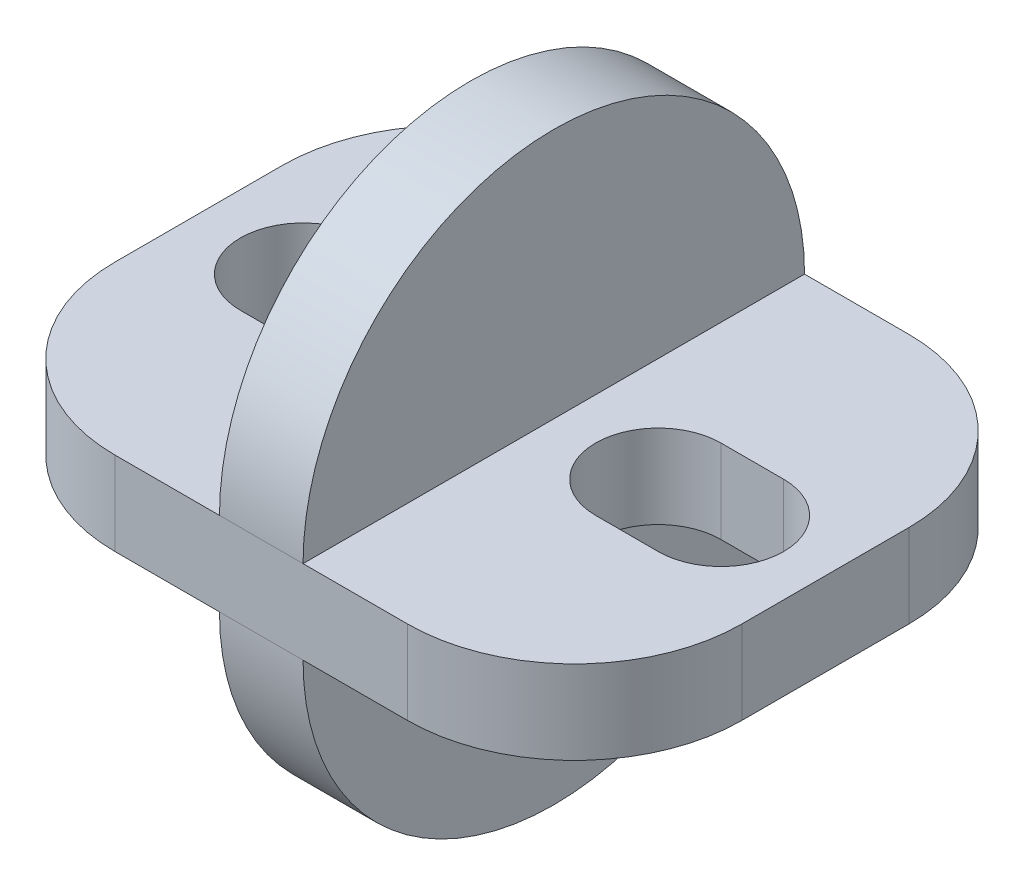
ISO-10303-21;
HEADER;
FILE_DESCRIPTION(('STEP AP214'),'2;1');
FILE_NAME('part.step','',(''),(''),'','','');
FILE_SCHEMA(('AUTOMOTIVE_DESIGN { 1 0 10303 214 1 1 1 1 }'));
ENDSEC;
DATA;
#1=APPLICATION_CONTEXT('core data for automotive mechanical design processes');
#2=APPLICATION_PROTOCOL_DEFINITION('international standard','automotive_design',2000,#1);
#3=PRODUCT_CONTEXT('',#1,'mechanical');
#4=PRODUCT('Part','Part','',(#3));
#5=PRODUCT_RELATED_PRODUCT_CATEGORY('part','',(#4));
#6=PRODUCT_DEFINITION_FORMATION('','',#4);
#7=PRODUCT_DEFINITION_CONTEXT('part definition',#1,'design');
#8=PRODUCT_DEFINITION('design','',#6,#7);
#9=PRODUCT_DEFINITION_SHAPE('','',#8);
#10=(LENGTH_UNIT() NAMED_UNIT(*) SI_UNIT(.MILLI.,.METRE.));
#11=(NAMED_UNIT(*) PLANE_ANGLE_UNIT() SI_UNIT($,.RADIAN.));
#12=(NAMED_UNIT(*) SI_UNIT($,.STERADIAN.) SOLID_ANGLE_UNIT());
#13=UNCERTAINTY_MEASURE_WITH_UNIT(LENGTH_MEASURE(1.E-05),#10,'distance_accuracy_value','');
#14=(GEOMETRIC_REPRESENTATION_CONTEXT(3) GLOBAL_UNCERTAINTY_ASSIGNED_CONTEXT((#13)) GLOBAL_UNIT_ASSIGNED_CONTEXT((#10,
#11,#12)) REPRESENTATION_CONTEXT('',''));
#15=CARTESIAN_POINT('',(0.,0.,0.));
#16=DIRECTION('',(0.,0.,1.));
#17=DIRECTION('',(1.,0.,0.));
#18=AXIS2_PLACEMENT_3D('',#15,#16,#17);
#19=CARTESIAN_POINT('',(0.,0.,0.));
#20=DIRECTION('',(0.,1.,0.));
#21=DIRECTION('',(0.,0.,1.));
#22=AXIS2_PLACEMENT_3D('',#19,#20,#21);
#23=PLANE('',#22);
#24=DIRECTION('',(-1.,0.,0.));
#25=VECTOR('',#24,1.);
#26=CARTESIAN_POINT('',(0.,0.,-15.));
#27=LINE('',#26,#25);
#28=CARTESIAN_POINT('',(-35.,0.,-15.));
#29=VERTEX_POINT('',#28);
#30=CARTESIAN_POINT('',(-50.,0.,-15.));
#31=VERTEX_POINT('',#30);
#32=EDGE_CURVE('E252',#29,#31,#27,.T.);
#33=ORIENTED_EDGE('',*,*,#32,.T.);
#34=CARTESIAN_POINT('',(-50.,0.,0.));
#35=DIRECTION('',(0.,1.,0.));
#36=DIRECTION('',(0.,0.,1.));
#37=AXIS2_PLACEMENT_3D('',#34,#35,#36);
#38=CIRCLE('',#37,15.);
#39=CARTESIAN_POINT('',(-50.,0.,15.));
#40=VERTEX_POINT('',#39);
#41=EDGE_CURVE('E221',#31,#40,#38,.T.);
#42=ORIENTED_EDGE('',*,*,#41,.T.);
#43=DIRECTION('',(1.,0.,0.));
#44=VECTOR('',#43,1.);
#45=CARTESIAN_POINT('',(0.,0.,15.));
#46=LINE('',#45,#44);
#47=CARTESIAN_POINT('',(-35.,0.,15.));
#48=VERTEX_POINT('',#47);
#49=EDGE_CURVE('E249',#40,#48,#46,.T.);
#50=ORIENTED_EDGE('',*,*,#49,.T.);
#51=CARTESIAN_POINT('',(-35.,0.,0.));
#52=DIRECTION('',(0.,1.,0.));
#53=DIRECTION('',(0.,0.,1.));
#54=AXIS2_PLACEMENT_3D('',#51,#52,#53);
#55=CIRCLE('',#54,15.);
#56=EDGE_CURVE('E231',#48,#29,#55,.T.);
#57=ORIENTED_EDGE('',*,*,#56,.T.);
#58=EDGE_LOOP('',(#33,#42,#50,#57));
#59=FACE_BOUND('',#58,.T.);
#60=DIRECTION('',(0.,0.,1.));
#61=VECTOR('',#60,1.);
#62=CARTESIAN_POINT('',(-10.,0.,-60.));
#63=LINE('',#62,#61);
#64=CARTESIAN_POINT('',(-10.,0.,-60.));
#65=VERTEX_POINT('',#64);
#66=CARTESIAN_POINT('',(-9.99999999999999,0.,60.));
#67=VERTEX_POINT('',#66);
#68=EDGE_CURVE('E260',#65,#67,#63,.T.);
#69=ORIENTED_EDGE('',*,*,#68,.T.);
#70=DIRECTION('',(1.,0.,0.));
#71=VECTOR('',#70,1.);
#72=CARTESIAN_POINT('',(75.,0.,60.));
#73=LINE('',#72,#71);
#74=CARTESIAN_POINT('',(-35.,0.,60.));
#75=VERTEX_POINT('',#74);
#76=EDGE_CURVE('E307',#75,#67,#73,.T.);
#77=ORIENTED_EDGE('',*,*,#76,.F.);
#78=CARTESIAN_POINT('',(-35.,0.,20.));
#79=DIRECTION('',(0.,1.,0.));
#80=DIRECTION('',(0.,0.,1.));
#81=AXIS2_PLACEMENT_3D('',#78,#79,#80);
#82=CIRCLE('',#81,40.);
#83=CARTESIAN_POINT('',(-75.,0.,20.));
#84=VERTEX_POINT('',#83);
#85=EDGE_CURVE('E320',#75,#84,#82,.F.);
#86=ORIENTED_EDGE('',*,*,#85,.T.);
#87=DIRECTION('',(0.,0.,1.));
#88=VECTOR('',#87,1.);
#89=CARTESIAN_POINT('',(-75.,0.,60.));
#90=LINE('',#89,#88);
#91=CARTESIAN_POINT('',(-75.,0.,-20.));
#92=VERTEX_POINT('',#91);
#93=EDGE_CURVE('E288',#92,#84,#90,.T.);
#94=ORIENTED_EDGE('',*,*,#93,.F.);
#95=CARTESIAN_POINT('',(-35.,0.,-20.));
#96=DIRECTION('',(0.,1.,0.));
#97=DIRECTION('',(0.,0.,1.));
#98=AXIS2_PLACEMENT_3D('',#95,#96,#97);
#99=CIRCLE('',#98,40.);
#100=CARTESIAN_POINT('',(-35.,0.,-60.));
#101=VERTEX_POINT('',#100);
#102=EDGE_CURVE('E322',#92,#101,#99,.F.);
#103=ORIENTED_EDGE('',*,*,#102,.T.);
#104=DIRECTION('',(-1.,0.,0.));
#105=VECTOR('',#104,1.);
#106=CARTESIAN_POINT('',(75.,0.,-60.));
#107=LINE('',#106,#105);
#108=EDGE_CURVE('E313',#65,#101,#107,.T.);
#109=ORIENTED_EDGE('',*,*,#108,.F.);
#110=EDGE_LOOP('',(#69,#77,#86,#94,#103,#109));
#111=FACE_BOUND('',#110,.T.);
#112=ADVANCED_FACE('F37',(#59,#111),#23,.F.);
#113=CARTESIAN_POINT('',(0.,20.,0.));
#114=DIRECTION('',(0.,1.,0.));
#115=DIRECTION('',(0.,0.,1.));
#116=AXIS2_PLACEMENT_3D('',#113,#114,#115);
#117=PLANE('',#116);
#118=CARTESIAN_POINT('',(50.,20.,0.));
#119=DIRECTION('',(0.,1.,0.));
#120=DIRECTION('',(0.,0.,1.));
#121=AXIS2_PLACEMENT_3D('',#118,#119,#120);
#122=CIRCLE('',#121,15.);
#123=CARTESIAN_POINT('',(50.,20.,15.));
#124=VERTEX_POINT('',#123);
#125=CARTESIAN_POINT('',(50.,20.,-15.));
#126=VERTEX_POINT('',#125);
#127=EDGE_CURVE('E189',#124,#126,#122,.T.);
#128=ORIENTED_EDGE('',*,*,#127,.F.);
#129=DIRECTION('',(1.,0.,0.));
#130=VECTOR('',#129,1.);
#131=CARTESIAN_POINT('',(0.,20.,15.));
#132=LINE('',#131,#130);
#133=CARTESIAN_POINT('',(35.,20.,15.));
#134=VERTEX_POINT('',#133);
#135=EDGE_CURVE('E246',#134,#124,#132,.T.);
#136=ORIENTED_EDGE('',*,*,#135,.F.);
#137=CARTESIAN_POINT('',(35.,20.,0.));
#138=DIRECTION('',(0.,1.,0.));
#139=DIRECTION('',(0.,0.,1.));
#140=AXIS2_PLACEMENT_3D('',#137,#138,#139);
#141=CIRCLE('',#140,15.);
#142=CARTESIAN_POINT('',(35.,20.,-15.));
#143=VERTEX_POINT('',#142);
#144=EDGE_CURVE('E244',#143,#134,#141,.T.);
#145=ORIENTED_EDGE('',*,*,#144,.F.);
#146=DIRECTION('',(-1.,0.,0.));
#147=VECTOR('',#146,1.);
#148=CARTESIAN_POINT('',(0.,20.,-15.));
#149=LINE('',#148,#147);
#150=EDGE_CURVE('E222',#126,#143,#149,.T.);
#151=ORIENTED_EDGE('',*,*,#150,.F.);
#152=EDGE_LOOP('',(#128,#136,#145,#151));
#153=FACE_BOUND('',#152,.T.);
#154=DIRECTION('',(-1.,0.,0.));
#155=VECTOR('',#154,1.);
#156=CARTESIAN_POINT('',(75.,20.,-60.));
#157=LINE('',#156,#155);
#158=CARTESIAN_POINT('',(35.,20.,-60.));
#159=VERTEX_POINT('',#158);
#160=CARTESIAN_POINT('',(9.99999999999999,20.,-60.));
#161=VERTEX_POINT('',#160);
#162=EDGE_CURVE('E300',#159,#161,#157,.T.);
#163=ORIENTED_EDGE('',*,*,#162,.T.);
#164=DIRECTION('',(0.,0.,-1.));
#165=VECTOR('',#164,1.);
#166=CARTESIAN_POINT('',(10.,20.,60.));
#167=LINE('',#166,#165);
#168=CARTESIAN_POINT('',(9.99999999999999,20.,60.));
#169=VERTEX_POINT('',#168);
#170=EDGE_CURVE('E275',#169,#161,#167,.T.);
#171=ORIENTED_EDGE('',*,*,#170,.F.);
#172=DIRECTION('',(1.,0.,0.));
#173=VECTOR('',#172,1.);
#174=CARTESIAN_POINT('',(75.,20.,60.));
#175=LINE('',#174,#173);
#176=CARTESIAN_POINT('',(35.,20.,60.));
#177=VERTEX_POINT('',#176);
#178=EDGE_CURVE('E292',#169,#177,#175,.T.);
#179=ORIENTED_EDGE('',*,*,#178,.T.);
#180=CARTESIAN_POINT('',(35.,20.,20.));
#181=DIRECTION('',(0.,1.,0.));
#182=DIRECTION('',(0.,0.,1.));
#183=AXIS2_PLACEMENT_3D('',#180,#181,#182);
#184=CIRCLE('',#183,40.);
#185=CARTESIAN_POINT('',(75.,20.,20.));
#186=VERTEX_POINT('',#185);
#187=EDGE_CURVE('E342',#177,#186,#184,.T.);
#188=ORIENTED_EDGE('',*,*,#187,.T.);
#189=DIRECTION('',(0.,0.,-1.));
#190=VECTOR('',#189,1.);
#191=CARTESIAN_POINT('',(75.,20.,60.));
#192=LINE('',#191,#190);
#193=CARTESIAN_POINT('',(75.,20.,-20.));
#194=VERTEX_POINT('',#193);
#195=EDGE_CURVE('E296',#186,#194,#192,.T.);
#196=ORIENTED_EDGE('',*,*,#195,.T.);
#197=CARTESIAN_POINT('',(35.,20.,-20.));
#198=DIRECTION('',(0.,1.,0.));
#199=DIRECTION('',(0.,0.,1.));
#200=AXIS2_PLACEMENT_3D('',#197,#198,#199);
#201=CIRCLE('',#200,40.);
#202=EDGE_CURVE('E340',#194,#159,#201,.T.);
#203=ORIENTED_EDGE('',*,*,#202,.T.);
#204=EDGE_LOOP('',(#163,#171,#179,#188,#196,#203));
#205=FACE_BOUND('',#204,.T.);
#206=ADVANCED_FACE('F361',(#153,#205),#117,.T.);
#207=CARTESIAN_POINT('',(-75.,20.,60.));
#208=DIRECTION('',(1.,0.,0.));
#209=DIRECTION('',(0.,0.,-1.));
#210=AXIS2_PLACEMENT_3D('',#207,#208,#209);
#211=PLANE('',#210);
#212=DIRECTION('',(0.,0.,1.));
#213=VECTOR('',#212,1.);
#214=CARTESIAN_POINT('',(-75.,20.,60.));
#215=LINE('',#214,#213);
#216=CARTESIAN_POINT('',(-75.,20.,-20.));
#217=VERTEX_POINT('',#216);
#218=CARTESIAN_POINT('',(-75.,20.,20.));
#219=VERTEX_POINT('',#218);
#220=EDGE_CURVE('E289',#217,#219,#215,.T.);
#221=ORIENTED_EDGE('',*,*,#220,.F.);
#222=DIRECTION('',(0.,-1.,0.));
#223=VECTOR('',#222,1.);
#224=CARTESIAN_POINT('',(-75.,20.,-20.));
#225=LINE('',#224,#223);
#226=EDGE_CURVE('E181',#217,#92,#225,.T.);
#227=ORIENTED_EDGE('',*,*,#226,.T.);
#228=ORIENTED_EDGE('',*,*,#93,.T.);
#229=DIRECTION('',(0.,-1.,0.));
#230=VECTOR('',#229,1.);
#231=CARTESIAN_POINT('',(-75.,20.,20.));
#232=LINE('',#231,#230);
#233=EDGE_CURVE('E350',#84,#219,#232,.F.);
#234=ORIENTED_EDGE('',*,*,#233,.T.);
#235=EDGE_LOOP('',(#221,#227,#228,#234));
#236=FACE_BOUND('',#235,.T.);
#237=ADVANCED_FACE('F364',(#236),#211,.F.);
#238=CARTESIAN_POINT('',(75.,20.,60.));
#239=DIRECTION('',(0.,0.,-1.));
#240=DIRECTION('',(-1.,0.,0.));
#241=AXIS2_PLACEMENT_3D('',#238,#239,#240);
#242=PLANE('',#241);
#243=ORIENTED_EDGE('',*,*,#76,.T.);
#244=DIRECTION('',(-1.,0.,0.));
#245=VECTOR('',#244,1.);
#246=CARTESIAN_POINT('',(10.,0.,60.));
#247=LINE('',#246,#245);
#248=CARTESIAN_POINT('',(9.99999999999999,0.,60.));
#249=VERTEX_POINT('',#248);
#250=EDGE_CURVE('E263',#249,#67,#247,.T.);
#251=ORIENTED_EDGE('',*,*,#250,.F.);
#252=CARTESIAN_POINT('',(35.,0.,60.));
#253=VERTEX_POINT('',#252);
#254=EDGE_CURVE('E306',#249,#253,#73,.T.);
#255=ORIENTED_EDGE('',*,*,#254,.T.);
#256=DIRECTION('',(0.,-1.,0.));
#257=VECTOR('',#256,1.);
#258=CARTESIAN_POINT('',(35.,20.,60.));
#259=LINE('',#258,#257);
#260=EDGE_CURVE('E333',#253,#177,#259,.F.);
#261=ORIENTED_EDGE('',*,*,#260,.T.);
#262=ORIENTED_EDGE('',*,*,#178,.F.);
#263=DIRECTION('',(-1.,0.,0.));
#264=VECTOR('',#263,1.);
#265=CARTESIAN_POINT('',(10.,20.,60.));
#266=LINE('',#265,#264);
#267=CARTESIAN_POINT('',(-10.,20.,60.));
#268=VERTEX_POINT('',#267);
#269=EDGE_CURVE('E285',#169,#268,#266,.T.);
#270=ORIENTED_EDGE('',*,*,#269,.T.);
#271=CARTESIAN_POINT('',(-35.,20.,60.));
#272=VERTEX_POINT('',#271);
#273=EDGE_CURVE('E294',#272,#268,#175,.T.);
#274=ORIENTED_EDGE('',*,*,#273,.F.);
#275=DIRECTION('',(0.,-1.,0.));
#276=VECTOR('',#275,1.);
#277=CARTESIAN_POINT('',(-35.,20.,60.));
#278=LINE('',#277,#276);
#279=EDGE_CURVE('E330',#272,#75,#278,.T.);
#280=ORIENTED_EDGE('',*,*,#279,.T.);
#281=EDGE_LOOP('',(#243,#251,#255,#261,#262,#270,#274,#280));
#282=FACE_BOUND('',#281,.T.);
#283=ADVANCED_FACE('F381',(#282),#242,.F.);
#284=CARTESIAN_POINT('',(75.,20.,60.));
#285=DIRECTION('',(-1.,0.,0.));
#286=DIRECTION('',(0.,0.,1.));
#287=AXIS2_PLACEMENT_3D('',#284,#285,#286);
#288=PLANE('',#287);
#289=ORIENTED_EDGE('',*,*,#195,.F.);
#290=DIRECTION('',(0.,-1.,0.));
#291=VECTOR('',#290,1.);
#292=CARTESIAN_POINT('',(75.,20.,20.));
#293=LINE('',#292,#291);
#294=CARTESIAN_POINT('',(75.,0.,20.));
#295=VERTEX_POINT('',#294);
#296=EDGE_CURVE('E317',#186,#295,#293,.T.);
#297=ORIENTED_EDGE('',*,*,#296,.T.);
#298=DIRECTION('',(0.,0.,-1.));
#299=VECTOR('',#298,1.);
#300=CARTESIAN_POINT('',(75.,0.,60.));
#301=LINE('',#300,#299);
#302=CARTESIAN_POINT('',(75.,0.,-20.));
#303=VERTEX_POINT('',#302);
#304=EDGE_CURVE('E310',#295,#303,#301,.T.);
#305=ORIENTED_EDGE('',*,*,#304,.T.);
#306=DIRECTION('',(0.,-1.,0.));
#307=VECTOR('',#306,1.);
#308=CARTESIAN_POINT('',(75.,20.,-20.));
#309=LINE('',#308,#307);
#310=EDGE_CURVE('E303',#303,#194,#309,.F.);
#311=ORIENTED_EDGE('',*,*,#310,.T.);
#312=EDGE_LOOP('',(#289,#297,#305,#311));
#313=FACE_BOUND('',#312,.T.);
#314=ADVANCED_FACE('F419',(#313),#288,.F.);
#315=CARTESIAN_POINT('',(75.,20.,-60.));
#316=DIRECTION('',(0.,0.,1.));
#317=DIRECTION('',(1.,0.,0.));
#318=AXIS2_PLACEMENT_3D('',#315,#316,#317);
#319=PLANE('',#318);
#320=ORIENTED_EDGE('',*,*,#162,.F.);
#321=DIRECTION('',(0.,-1.,0.));
#322=VECTOR('',#321,1.);
#323=CARTESIAN_POINT('',(35.,20.,-60.));
#324=LINE('',#323,#322);
#325=CARTESIAN_POINT('',(35.,0.,-60.));
#326=VERTEX_POINT('',#325);
#327=EDGE_CURVE('E347',#159,#326,#324,.T.);
#328=ORIENTED_EDGE('',*,*,#327,.T.);
#329=CARTESIAN_POINT('',(9.99999999999999,0.,-60.));
#330=VERTEX_POINT('',#329);
#331=EDGE_CURVE('E293',#326,#330,#107,.T.);
#332=ORIENTED_EDGE('',*,*,#331,.T.);
#333=DIRECTION('',(-1.,0.,0.));
#334=VECTOR('',#333,1.);
#335=CARTESIAN_POINT('',(10.,0.,-60.));
#336=LINE('',#335,#334);
#337=EDGE_CURVE('E269',#330,#65,#336,.T.);
#338=ORIENTED_EDGE('',*,*,#337,.T.);
#339=ORIENTED_EDGE('',*,*,#108,.T.);
#340=DIRECTION('',(0.,-1.,0.));
#341=VECTOR('',#340,1.);
#342=CARTESIAN_POINT('',(-35.,20.,-60.));
#343=LINE('',#342,#341);
#344=CARTESIAN_POINT('',(-35.,20.,-60.));
#345=VERTEX_POINT('',#344);
#346=EDGE_CURVE('E344',#101,#345,#343,.F.);
#347=ORIENTED_EDGE('',*,*,#346,.T.);
#348=CARTESIAN_POINT('',(-9.99999999999999,20.,-60.));
#349=VERTEX_POINT('',#348);
#350=EDGE_CURVE('E299',#349,#345,#157,.T.);
#351=ORIENTED_EDGE('',*,*,#350,.F.);
#352=DIRECTION('',(-1.,0.,0.));
#353=VECTOR('',#352,1.);
#354=CARTESIAN_POINT('',(10.,20.,-60.));
#355=LINE('',#354,#353);
#356=EDGE_CURVE('E279',#161,#349,#355,.T.);
#357=ORIENTED_EDGE('',*,*,#356,.F.);
#358=EDGE_LOOP('',(#320,#328,#332,#338,#339,#347,#351,#357));
#359=FACE_BOUND('',#358,.T.);
#360=ADVANCED_FACE('F386',(#359),#319,.F.);
#361=CARTESIAN_POINT('',(-50.,20.,0.));
#362=DIRECTION('',(0.,1.,0.));
#363=DIRECTION('',(0.,0.,1.));
#364=AXIS2_PLACEMENT_3D('',#361,#362,#363);
#365=CIRCLE('',#364,15.);
#366=CARTESIAN_POINT('',(-50.,20.,-15.));
#367=VERTEX_POINT('',#366);
#368=CARTESIAN_POINT('',(-50.,20.,15.));
#369=VERTEX_POINT('',#368);
#370=EDGE_CURVE('E11',#367,#369,#365,.T.);
#371=ORIENTED_EDGE('',*,*,#370,.F.);
#372=DIRECTION('',(-1.,0.,0.));
#373=VECTOR('',#372,1.);
#374=CARTESIAN_POINT('',(0.,20.,-15.));
#375=LINE('',#374,#373);
#376=CARTESIAN_POINT('',(-35.,20.,-15.));
#377=VERTEX_POINT('',#376);
#378=EDGE_CURVE('E45',#377,#367,#375,.T.);
#379=ORIENTED_EDGE('',*,*,#378,.F.);
#380=CARTESIAN_POINT('',(-35.,20.,0.));
#381=DIRECTION('',(0.,1.,0.));
#382=DIRECTION('',(0.,0.,1.));
#383=AXIS2_PLACEMENT_3D('',#380,#381,#382);
#384=CIRCLE('',#383,15.);
#385=CARTESIAN_POINT('',(-35.,20.,15.));
#386=VERTEX_POINT('',#385);
#387=EDGE_CURVE('E198',#386,#377,#384,.T.);
#388=ORIENTED_EDGE('',*,*,#387,.F.);
#389=DIRECTION('',(1.,0.,0.));
#390=VECTOR('',#389,1.);
#391=CARTESIAN_POINT('',(0.,20.,15.));
#392=LINE('',#391,#390);
#393=EDGE_CURVE('E196',#369,#386,#392,.T.);
#394=ORIENTED_EDGE('',*,*,#393,.F.);
#395=EDGE_LOOP('',(#371,#379,#388,#394));
#396=FACE_BOUND('',#395,.T.);
#397=DIRECTION('',(0.,0.,-1.));
#398=VECTOR('',#397,1.);
#399=CARTESIAN_POINT('',(-10.,20.,60.));
#400=LINE('',#399,#398);
#401=EDGE_CURVE('E276',#268,#349,#400,.T.);
#402=ORIENTED_EDGE('',*,*,#401,.T.);
#403=ORIENTED_EDGE('',*,*,#350,.T.);
#404=CARTESIAN_POINT('',(-35.,20.,-20.));
#405=DIRECTION('',(0.,1.,0.));
#406=DIRECTION('',(0.,0.,1.));
#407=AXIS2_PLACEMENT_3D('',#404,#405,#406);
#408=CIRCLE('',#407,40.);
#409=EDGE_CURVE('E338',#345,#217,#408,.T.);
#410=ORIENTED_EDGE('',*,*,#409,.T.);
#411=ORIENTED_EDGE('',*,*,#220,.T.);
#412=CARTESIAN_POINT('',(-35.,20.,20.));
#413=DIRECTION('',(0.,1.,0.));
#414=DIRECTION('',(0.,0.,1.));
#415=AXIS2_PLACEMENT_3D('',#412,#413,#414);
#416=CIRCLE('',#415,40.);
#417=EDGE_CURVE('E336',#219,#272,#416,.T.);
#418=ORIENTED_EDGE('',*,*,#417,.T.);
#419=ORIENTED_EDGE('',*,*,#273,.T.);
#420=EDGE_LOOP('',(#402,#403,#410,#411,#418,#419));
#421=FACE_BOUND('',#420,.T.);
#422=ADVANCED_FACE('F224',(#396,#421),#117,.T.);
#423=DIRECTION('',(1.,0.,0.));
#424=VECTOR('',#423,1.);
#425=CARTESIAN_POINT('',(0.,0.,15.));
#426=LINE('',#425,#424);
#427=CARTESIAN_POINT('',(35.,0.,15.));
#428=VERTEX_POINT('',#427);
#429=CARTESIAN_POINT('',(50.,0.,15.));
#430=VERTEX_POINT('',#429);
#431=EDGE_CURVE('E195',#428,#430,#426,.T.);
#432=ORIENTED_EDGE('',*,*,#431,.T.);
#433=CARTESIAN_POINT('',(50.,0.,0.));
#434=DIRECTION('',(0.,1.,0.));
#435=DIRECTION('',(0.,0.,1.));
#436=AXIS2_PLACEMENT_3D('',#433,#434,#435);
#437=CIRCLE('',#436,15.);
#438=CARTESIAN_POINT('',(50.,0.,-15.));
#439=VERTEX_POINT('',#438);
#440=EDGE_CURVE('E186',#430,#439,#437,.T.);
#441=ORIENTED_EDGE('',*,*,#440,.T.);
#442=DIRECTION('',(-1.,0.,0.));
#443=VECTOR('',#442,1.);
#444=CARTESIAN_POINT('',(0.,0.,-15.));
#445=LINE('',#444,#443);
#446=CARTESIAN_POINT('',(35.,0.,-15.));
#447=VERTEX_POINT('',#446);
#448=EDGE_CURVE('E172',#439,#447,#445,.T.);
#449=ORIENTED_EDGE('',*,*,#448,.T.);
#450=CARTESIAN_POINT('',(35.,0.,0.));
#451=DIRECTION('',(0.,1.,0.));
#452=DIRECTION('',(0.,0.,1.));
#453=AXIS2_PLACEMENT_3D('',#450,#451,#452);
#454=CIRCLE('',#453,15.);
#455=EDGE_CURVE('E180',#447,#428,#454,.T.);
#456=ORIENTED_EDGE('',*,*,#455,.T.);
#457=EDGE_LOOP('',(#432,#441,#449,#456));
#458=FACE_BOUND('',#457,.T.);
#459=ORIENTED_EDGE('',*,*,#254,.F.);
#460=DIRECTION('',(0.,0.,1.));
#461=VECTOR('',#460,1.);
#462=CARTESIAN_POINT('',(10.,0.,-60.));
#463=LINE('',#462,#461);
#464=EDGE_CURVE('E259',#330,#249,#463,.T.);
#465=ORIENTED_EDGE('',*,*,#464,.F.);
#466=ORIENTED_EDGE('',*,*,#331,.F.);
#467=CARTESIAN_POINT('',(35.,0.,-20.));
#468=DIRECTION('',(0.,1.,0.));
#469=DIRECTION('',(0.,0.,1.));
#470=AXIS2_PLACEMENT_3D('',#467,#468,#469);
#471=CIRCLE('',#470,40.);
#472=EDGE_CURVE('E325',#326,#303,#471,.F.);
#473=ORIENTED_EDGE('',*,*,#472,.T.);
#474=ORIENTED_EDGE('',*,*,#304,.F.);
#475=CARTESIAN_POINT('',(35.,0.,20.));
#476=DIRECTION('',(0.,1.,0.));
#477=DIRECTION('',(0.,0.,1.));
#478=AXIS2_PLACEMENT_3D('',#475,#476,#477);
#479=CIRCLE('',#478,40.);
#480=EDGE_CURVE('E327',#295,#253,#479,.F.);
#481=ORIENTED_EDGE('',*,*,#480,.T.);
#482=EDGE_LOOP('',(#459,#465,#466,#473,#474,#481));
#483=FACE_BOUND('',#482,.T.);
#484=ADVANCED_FACE('F193',(#458,#483),#23,.F.);
#485=CARTESIAN_POINT('',(35.,20.,20.));
#486=DIRECTION('',(0.,-1.,0.));
#487=DIRECTION('',(0.,0.,-1.));
#488=AXIS2_PLACEMENT_3D('',#485,#486,#487);
#489=CYLINDRICAL_SURFACE('',#488,40.);
#490=ORIENTED_EDGE('',*,*,#187,.F.);
#491=ORIENTED_EDGE('',*,*,#260,.F.);
#492=ORIENTED_EDGE('',*,*,#480,.F.);
#493=ORIENTED_EDGE('',*,*,#296,.F.);
#494=EDGE_LOOP('',(#490,#491,#492,#493));
#495=FACE_BOUND('',#494,.T.);
#496=ADVANCED_FACE('F423',(#495),#489,.T.);
#497=CARTESIAN_POINT('',(35.,20.,-20.));
#498=DIRECTION('',(0.,-1.,0.));
#499=DIRECTION('',(0.,0.,-1.));
#500=AXIS2_PLACEMENT_3D('',#497,#498,#499);
#501=CYLINDRICAL_SURFACE('',#500,40.);
#502=ORIENTED_EDGE('',*,*,#202,.F.);
#503=ORIENTED_EDGE('',*,*,#310,.F.);
#504=ORIENTED_EDGE('',*,*,#472,.F.);
#505=ORIENTED_EDGE('',*,*,#327,.F.);
#506=EDGE_LOOP('',(#502,#503,#504,#505));
#507=FACE_BOUND('',#506,.T.);
#508=ADVANCED_FACE('F414',(#507),#501,.T.);
#509=CARTESIAN_POINT('',(-35.,20.,-20.));
#510=DIRECTION('',(0.,-1.,0.));
#511=DIRECTION('',(0.,0.,-1.));
#512=AXIS2_PLACEMENT_3D('',#509,#510,#511);
#513=CYLINDRICAL_SURFACE('',#512,40.);
#514=ORIENTED_EDGE('',*,*,#409,.F.);
#515=ORIENTED_EDGE('',*,*,#346,.F.);
#516=ORIENTED_EDGE('',*,*,#102,.F.);
#517=ORIENTED_EDGE('',*,*,#226,.F.);
#518=EDGE_LOOP('',(#514,#515,#516,#517));
#519=FACE_BOUND('',#518,.T.);
#520=ADVANCED_FACE('F392',(#519),#513,.T.);
#521=CARTESIAN_POINT('',(-35.,20.,20.));
#522=DIRECTION('',(0.,-1.,0.));
#523=DIRECTION('',(0.,0.,-1.));
#524=AXIS2_PLACEMENT_3D('',#521,#522,#523);
#525=CYLINDRICAL_SURFACE('',#524,40.);
#526=ORIENTED_EDGE('',*,*,#417,.F.);
#527=ORIENTED_EDGE('',*,*,#233,.F.);
#528=ORIENTED_EDGE('',*,*,#85,.F.);
#529=ORIENTED_EDGE('',*,*,#279,.F.);
#530=EDGE_LOOP('',(#526,#527,#528,#529));
#531=FACE_BOUND('',#530,.T.);
#532=ADVANCED_FACE('F39',(#531),#525,.T.);
#533=CARTESIAN_POINT('',(10.,20.,0.));
#534=DIRECTION('',(-1.,0.,0.));
#535=DIRECTION('',(0.,0.,1.));
#536=AXIS2_PLACEMENT_3D('',#533,#534,#535);
#537=CYLINDRICAL_SURFACE('',#536,60.);
#538=CARTESIAN_POINT('',(-10.,20.,0.));
#539=DIRECTION('',(1.,0.,0.));
#540=DIRECTION('',(0.,0.,1.));
#541=AXIS2_PLACEMENT_3D('',#538,#539,#540);
#542=CIRCLE('',#541,60.);
#543=EDGE_CURVE('E271',#349,#268,#542,.T.);
#544=ORIENTED_EDGE('',*,*,#543,.T.);
#545=ORIENTED_EDGE('',*,*,#269,.F.);
#546=CARTESIAN_POINT('',(10.,20.,0.));
#547=DIRECTION('',(1.,0.,0.));
#548=DIRECTION('',(0.,0.,1.));
#549=AXIS2_PLACEMENT_3D('',#546,#547,#548);
#550=CIRCLE('',#549,60.);
#551=EDGE_CURVE('E272',#161,#169,#550,.T.);
#552=ORIENTED_EDGE('',*,*,#551,.F.);
#553=ORIENTED_EDGE('',*,*,#356,.T.);
#554=EDGE_LOOP('',(#544,#545,#552,#553));
#555=FACE_BOUND('',#554,.T.);
#556=ADVANCED_FACE('F376',(#555),#537,.T.);
#557=CARTESIAN_POINT('',(10.,20.,0.));
#558=DIRECTION('',(-1.,0.,0.));
#559=DIRECTION('',(0.,0.,1.));
#560=AXIS2_PLACEMENT_3D('',#557,#558,#559);
#561=PLANE('',#560);
#562=ORIENTED_EDGE('',*,*,#551,.T.);
#563=ORIENTED_EDGE('',*,*,#170,.T.);
#564=EDGE_LOOP('',(#562,#563));
#565=FACE_BOUND('',#564,.T.);
#566=ADVANCED_FACE('F373',(#565),#561,.F.);
#567=CARTESIAN_POINT('',(-10.,20.,0.));
#568=DIRECTION('',(-1.,0.,0.));
#569=DIRECTION('',(0.,0.,1.));
#570=AXIS2_PLACEMENT_3D('',#567,#568,#569);
#571=PLANE('',#570);
#572=ORIENTED_EDGE('',*,*,#543,.F.);
#573=ORIENTED_EDGE('',*,*,#401,.F.);
#574=EDGE_LOOP('',(#572,#573));
#575=FACE_BOUND('',#574,.T.);
#576=ADVANCED_FACE('F384',(#575),#571,.T.);
#577=CARTESIAN_POINT('',(10.,0.,0.));
#578=DIRECTION('',(-1.,0.,0.));
#579=DIRECTION('',(0.,0.,1.));
#580=AXIS2_PLACEMENT_3D('',#577,#578,#579);
#581=CYLINDRICAL_SURFACE('',#580,60.);
#582=CARTESIAN_POINT('',(-10.,0.,0.));
#583=DIRECTION('',(1.,0.,0.));
#584=DIRECTION('',(0.,0.,-1.));
#585=AXIS2_PLACEMENT_3D('',#582,#583,#584);
#586=CIRCLE('',#585,60.);
#587=EDGE_CURVE('E255',#67,#65,#586,.T.);
#588=ORIENTED_EDGE('',*,*,#587,.T.);
#589=ORIENTED_EDGE('',*,*,#337,.F.);
#590=CARTESIAN_POINT('',(10.,0.,0.));
#591=DIRECTION('',(1.,0.,0.));
#592=DIRECTION('',(0.,0.,-1.));
#593=AXIS2_PLACEMENT_3D('',#590,#591,#592);
#594=CIRCLE('',#593,60.);
#595=EDGE_CURVE('E256',#249,#330,#594,.T.);
#596=ORIENTED_EDGE('',*,*,#595,.F.);
#597=ORIENTED_EDGE('',*,*,#250,.T.);
#598=EDGE_LOOP('',(#588,#589,#596,#597));
#599=FACE_BOUND('',#598,.T.);
#600=ADVANCED_FACE('F408',(#599),#581,.T.);
#601=CARTESIAN_POINT('',(10.,0.,0.));
#602=DIRECTION('',(1.,0.,0.));
#603=DIRECTION('',(0.,0.,-1.));
#604=AXIS2_PLACEMENT_3D('',#601,#602,#603);
#605=PLANE('',#604);
#606=ORIENTED_EDGE('',*,*,#595,.T.);
#607=ORIENTED_EDGE('',*,*,#464,.T.);
#608=EDGE_LOOP('',(#606,#607));
#609=FACE_BOUND('',#608,.T.);
#610=ADVANCED_FACE('F411',(#609),#605,.T.);
#611=CARTESIAN_POINT('',(-10.,0.,0.));
#612=DIRECTION('',(1.,0.,0.));
#613=DIRECTION('',(0.,0.,-1.));
#614=AXIS2_PLACEMENT_3D('',#611,#612,#613);
#615=PLANE('',#614);
#616=ORIENTED_EDGE('',*,*,#587,.F.);
#617=ORIENTED_EDGE('',*,*,#68,.F.);
#618=EDGE_LOOP('',(#616,#617));
#619=FACE_BOUND('',#618,.T.);
#620=ADVANCED_FACE('F405',(#619),#615,.F.);
#621=CARTESIAN_POINT('',(50.,-13.5,0.));
#622=DIRECTION('',(0.,1.,0.));
#623=DIRECTION('',(0.,0.,1.));
#624=AXIS2_PLACEMENT_3D('',#621,#622,#623);
#625=CYLINDRICAL_SURFACE('',#624,15.);
#626=ORIENTED_EDGE('',*,*,#127,.T.);
#627=DIRECTION('',(0.,1.,0.));
#628=VECTOR('',#627,1.);
#629=CARTESIAN_POINT('',(50.,-13.5,-15.));
#630=LINE('',#629,#628);
#631=EDGE_CURVE('E60',#439,#126,#630,.T.);
#632=ORIENTED_EDGE('',*,*,#631,.F.);
#633=ORIENTED_EDGE('',*,*,#440,.F.);
#634=DIRECTION('',(0.,1.,0.));
#635=VECTOR('',#634,1.);
#636=CARTESIAN_POINT('',(50.,-13.5,15.));
#637=LINE('',#636,#635);
#638=EDGE_CURVE('E235',#430,#124,#637,.T.);
#639=ORIENTED_EDGE('',*,*,#638,.T.);
#640=EDGE_LOOP('',(#626,#632,#633,#639));
#641=FACE_BOUND('',#640,.T.);
#642=ADVANCED_FACE('F184',(#641),#625,.F.);
#643=CARTESIAN_POINT('',(50.,-13.5,15.));
#644=DIRECTION('',(0.,0.,1.));
#645=DIRECTION('',(1.,0.,0.));
#646=AXIS2_PLACEMENT_3D('',#643,#644,#645);
#647=PLANE('',#646);
#648=ORIENTED_EDGE('',*,*,#135,.T.);
#649=ORIENTED_EDGE('',*,*,#638,.F.);
#650=ORIENTED_EDGE('',*,*,#431,.F.);
#651=DIRECTION('',(0.,1.,0.));
#652=VECTOR('',#651,1.);
#653=CARTESIAN_POINT('',(35.,-13.5,15.));
#654=LINE('',#653,#652);
#655=EDGE_CURVE('E239',#428,#134,#654,.T.);
#656=ORIENTED_EDGE('',*,*,#655,.T.);
#657=EDGE_LOOP('',(#648,#649,#650,#656));
#658=FACE_BOUND('',#657,.T.);
#659=ADVANCED_FACE('F359',(#658),#647,.F.);
#660=CARTESIAN_POINT('',(35.,-13.5,0.));
#661=DIRECTION('',(0.,1.,0.));
#662=DIRECTION('',(0.,0.,1.));
#663=AXIS2_PLACEMENT_3D('',#660,#661,#662);
#664=CYLINDRICAL_SURFACE('',#663,15.);
#665=ORIENTED_EDGE('',*,*,#144,.T.);
#666=ORIENTED_EDGE('',*,*,#655,.F.);
#667=ORIENTED_EDGE('',*,*,#455,.F.);
#668=DIRECTION('',(0.,1.,0.));
#669=VECTOR('',#668,1.);
#670=CARTESIAN_POINT('',(35.,-13.5,-15.));
#671=LINE('',#670,#669);
#672=EDGE_CURVE('E175',#447,#143,#671,.T.);
#673=ORIENTED_EDGE('',*,*,#672,.T.);
#674=EDGE_LOOP('',(#665,#666,#667,#673));
#675=FACE_BOUND('',#674,.T.);
#676=ADVANCED_FACE('F355',(#675),#664,.F.);
#677=CARTESIAN_POINT('',(50.,-13.5,-15.));
#678=DIRECTION('',(0.,0.,-1.));
#679=DIRECTION('',(-1.,0.,0.));
#680=AXIS2_PLACEMENT_3D('',#677,#678,#679);
#681=PLANE('',#680);
#682=ORIENTED_EDGE('',*,*,#150,.T.);
#683=ORIENTED_EDGE('',*,*,#672,.F.);
#684=ORIENTED_EDGE('',*,*,#448,.F.);
#685=ORIENTED_EDGE('',*,*,#631,.T.);
#686=EDGE_LOOP('',(#682,#683,#684,#685));
#687=FACE_BOUND('',#686,.T.);
#688=ADVANCED_FACE('F173',(#687),#681,.F.);
#689=CARTESIAN_POINT('',(-50.,-13.5,0.));
#690=DIRECTION('',(0.,1.,0.));
#691=DIRECTION('',(0.,0.,1.));
#692=AXIS2_PLACEMENT_3D('',#689,#690,#691);
#693=CYLINDRICAL_SURFACE('',#692,15.);
#694=DIRECTION('',(0.,1.,0.));
#695=VECTOR('',#694,1.);
#696=CARTESIAN_POINT('',(-50.,-13.5,-15.));
#697=LINE('',#696,#695);
#698=EDGE_CURVE('E209',#31,#367,#697,.T.);
#699=ORIENTED_EDGE('',*,*,#698,.T.);
#700=ORIENTED_EDGE('',*,*,#370,.T.);
#701=DIRECTION('',(0.,1.,0.));
#702=VECTOR('',#701,1.);
#703=CARTESIAN_POINT('',(-50.,-13.5,15.));
#704=LINE('',#703,#702);
#705=EDGE_CURVE('E227',#40,#369,#704,.T.);
#706=ORIENTED_EDGE('',*,*,#705,.F.);
#707=ORIENTED_EDGE('',*,*,#41,.F.);
#708=EDGE_LOOP('',(#699,#700,#706,#707));
#709=FACE_BOUND('',#708,.T.);
#710=ADVANCED_FACE('F217',(#709),#693,.F.);
#711=CARTESIAN_POINT('',(-50.,-13.5,-15.));
#712=DIRECTION('',(0.,0.,-1.));
#713=DIRECTION('',(-1.,0.,0.));
#714=AXIS2_PLACEMENT_3D('',#711,#712,#713);
#715=PLANE('',#714);
#716=DIRECTION('',(0.,1.,0.));
#717=VECTOR('',#716,1.);
#718=CARTESIAN_POINT('',(-35.,-13.5,-15.));
#719=LINE('',#718,#717);
#720=EDGE_CURVE('E212',#29,#377,#719,.T.);
#721=ORIENTED_EDGE('',*,*,#720,.T.);
#722=ORIENTED_EDGE('',*,*,#378,.T.);
#723=ORIENTED_EDGE('',*,*,#698,.F.);
#724=ORIENTED_EDGE('',*,*,#32,.F.);
#725=EDGE_LOOP('',(#721,#722,#723,#724));
#726=FACE_BOUND('',#725,.T.);
#727=ADVANCED_FACE('F208',(#726),#715,.F.);
#728=CARTESIAN_POINT('',(-35.,-13.5,0.));
#729=DIRECTION('',(0.,1.,0.));
#730=DIRECTION('',(0.,0.,1.));
#731=AXIS2_PLACEMENT_3D('',#728,#729,#730);
#732=CYLINDRICAL_SURFACE('',#731,15.);
#733=DIRECTION('',(0.,1.,0.));
#734=VECTOR('',#733,1.);
#735=CARTESIAN_POINT('',(-35.,-13.5,15.));
#736=LINE('',#735,#734);
#737=EDGE_CURVE('E52',#48,#386,#736,.T.);
#738=ORIENTED_EDGE('',*,*,#737,.T.);
#739=ORIENTED_EDGE('',*,*,#387,.T.);
#740=ORIENTED_EDGE('',*,*,#720,.F.);
#741=ORIENTED_EDGE('',*,*,#56,.F.);
#742=EDGE_LOOP('',(#738,#739,#740,#741));
#743=FACE_BOUND('',#742,.T.);
#744=ADVANCED_FACE('F229',(#743),#732,.F.);
#745=CARTESIAN_POINT('',(-50.,-13.5,15.));
#746=DIRECTION('',(0.,0.,1.));
#747=DIRECTION('',(1.,0.,0.));
#748=AXIS2_PLACEMENT_3D('',#745,#746,#747);
#749=PLANE('',#748);
#750=ORIENTED_EDGE('',*,*,#705,.T.);
#751=ORIENTED_EDGE('',*,*,#393,.T.);
#752=ORIENTED_EDGE('',*,*,#737,.F.);
#753=ORIENTED_EDGE('',*,*,#49,.F.);
#754=EDGE_LOOP('',(#750,#751,#752,#753));
#755=FACE_BOUND('',#754,.T.);
#756=ADVANCED_FACE('F226',(#755),#749,.F.);
#757=CLOSED_SHELL('',(#112,#206,#237,#283,#314,#360,#422,#484,#496,#508,#520,#532,#556,#566,
#576,#600,#610,#620,#642,#659,#676,#688,#710,#727,#744,#756));
#758=MANIFOLD_SOLID_BREP('B2',#757);
#759=ADVANCED_BREP_SHAPE_REPRESENTATION('',(#18,#758),#14);
#760=SHAPE_DEFINITION_REPRESENTATION(#9,#759);
ENDSEC;
END-ISO-10303-21;
